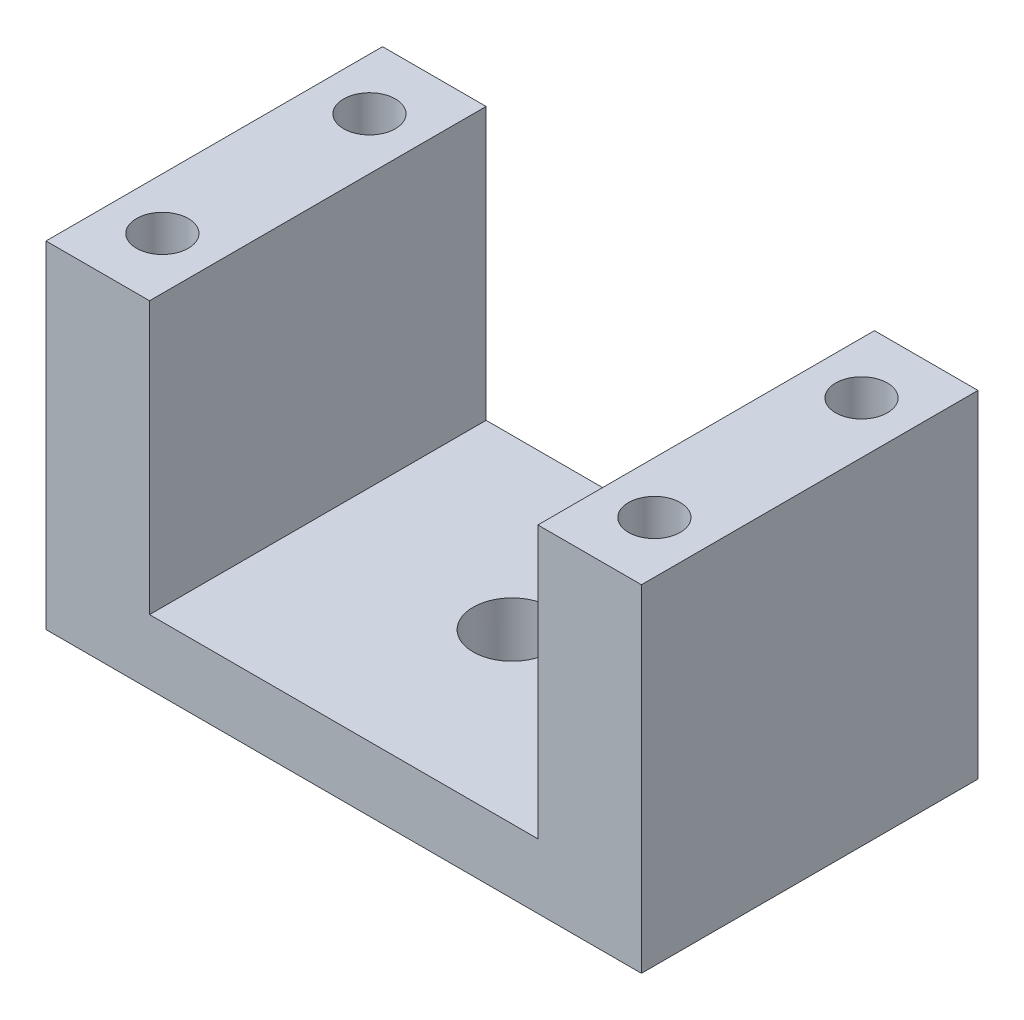
ISO-10303-21;
HEADER;
FILE_DESCRIPTION(('STEP AP214'),'2;1');
FILE_NAME('part.step','',(''),(''),'','','');
FILE_SCHEMA(('AUTOMOTIVE_DESIGN { 1 0 10303 214 1 1 1 1 }'));
ENDSEC;
DATA;
#1=APPLICATION_CONTEXT('core data for automotive mechanical design processes');
#2=APPLICATION_PROTOCOL_DEFINITION('international standard','automotive_design',2000,#1);
#3=PRODUCT_CONTEXT('',#1,'mechanical');
#4=PRODUCT('Part','Part','',(#3));
#5=PRODUCT_RELATED_PRODUCT_CATEGORY('part','',(#4));
#6=PRODUCT_DEFINITION_FORMATION('','',#4);
#7=PRODUCT_DEFINITION_CONTEXT('part definition',#1,'design');
#8=PRODUCT_DEFINITION('design','',#6,#7);
#9=PRODUCT_DEFINITION_SHAPE('','',#8);
#10=(LENGTH_UNIT() NAMED_UNIT(*) SI_UNIT(.MILLI.,.METRE.));
#11=(NAMED_UNIT(*) PLANE_ANGLE_UNIT() SI_UNIT($,.RADIAN.));
#12=(NAMED_UNIT(*) SI_UNIT($,.STERADIAN.) SOLID_ANGLE_UNIT());
#13=UNCERTAINTY_MEASURE_WITH_UNIT(LENGTH_MEASURE(1.E-05),#10,'distance_accuracy_value','');
#14=(GEOMETRIC_REPRESENTATION_CONTEXT(3) GLOBAL_UNCERTAINTY_ASSIGNED_CONTEXT((#13)) GLOBAL_UNIT_ASSIGNED_CONTEXT((#10,
#11,#12)) REPRESENTATION_CONTEXT('',''));
#15=CARTESIAN_POINT('',(0.,0.,0.));
#16=DIRECTION('',(0.,0.,1.));
#17=DIRECTION('',(1.,0.,0.));
#18=AXIS2_PLACEMENT_3D('',#15,#16,#17);
#19=CARTESIAN_POINT('',(11.5,6.5,13.));
#20=DIRECTION('',(-1.,0.,0.));
#21=DIRECTION('',(0.,0.,1.));
#22=AXIS2_PLACEMENT_3D('',#19,#20,#21);
#23=PLANE('',#22);
#24=DIRECTION('',(0.,1.,0.));
#25=VECTOR('',#24,1.);
#26=CARTESIAN_POINT('',(11.5,6.5,0.));
#27=LINE('',#26,#25);
#28=CARTESIAN_POINT('',(11.5,-6.5,0.));
#29=VERTEX_POINT('',#28);
#30=CARTESIAN_POINT('',(11.5,6.5,0.));
#31=VERTEX_POINT('',#30);
#32=EDGE_CURVE('E130',#29,#31,#27,.T.);
#33=ORIENTED_EDGE('',*,*,#32,.T.);
#34=DIRECTION('',(0.,0.,-1.));
#35=VECTOR('',#34,1.);
#36=CARTESIAN_POINT('',(11.5,6.5,13.));
#37=LINE('',#36,#35);
#38=CARTESIAN_POINT('',(11.5,6.5,13.));
#39=VERTEX_POINT('',#38);
#40=EDGE_CURVE('E11',#39,#31,#37,.T.);
#41=ORIENTED_EDGE('',*,*,#40,.F.);
#42=DIRECTION('',(0.,1.,0.));
#43=VECTOR('',#42,1.);
#44=CARTESIAN_POINT('',(11.5,6.5,13.));
#45=LINE('',#44,#43);
#46=CARTESIAN_POINT('',(11.5,-6.5,13.));
#47=VERTEX_POINT('',#46);
#48=EDGE_CURVE('E145',#47,#39,#45,.T.);
#49=ORIENTED_EDGE('',*,*,#48,.F.);
#50=DIRECTION('',(0.,0.,-1.));
#51=VECTOR('',#50,1.);
#52=CARTESIAN_POINT('',(11.5,-6.5,13.));
#53=LINE('',#52,#51);
#54=EDGE_CURVE('E126',#47,#29,#53,.T.);
#55=ORIENTED_EDGE('',*,*,#54,.T.);
#56=EDGE_LOOP('',(#33,#41,#49,#55));
#57=FACE_BOUND('',#56,.T.);
#58=ADVANCED_FACE('F34',(#57),#23,.F.);
#59=CARTESIAN_POINT('',(7.5,6.5,13.));
#60=DIRECTION('',(0.,-1.,0.));
#61=DIRECTION('',(0.,0.,-1.));
#62=AXIS2_PLACEMENT_3D('',#59,#60,#61);
#63=PLANE('',#62);
#64=CARTESIAN_POINT('',(9.5,6.5,2.5));
#65=DIRECTION('',(0.,1.,0.));
#66=DIRECTION('',(0.,0.,1.));
#67=AXIS2_PLACEMENT_3D('',#64,#65,#66);
#68=CIRCLE('',#67,1.);
#69=CARTESIAN_POINT('',(9.5,6.5,3.5));
#70=VERTEX_POINT('',#69);
#71=EDGE_CURVE('E187',#70,#70,#68,.T.);
#72=ORIENTED_EDGE('',*,*,#71,.F.);
#73=EDGE_LOOP('',(#72));
#74=FACE_BOUND('',#73,.T.);
#75=CARTESIAN_POINT('',(9.5,6.5,10.5));
#76=DIRECTION('',(0.,1.,0.));
#77=DIRECTION('',(0.,0.,1.));
#78=AXIS2_PLACEMENT_3D('',#75,#76,#77);
#79=CIRCLE('',#78,1.);
#80=CARTESIAN_POINT('',(9.5,6.5,11.5));
#81=VERTEX_POINT('',#80);
#82=EDGE_CURVE('E202',#81,#81,#79,.T.);
#83=ORIENTED_EDGE('',*,*,#82,.F.);
#84=EDGE_LOOP('',(#83));
#85=FACE_BOUND('',#84,.T.);
#86=DIRECTION('',(-1.,0.,0.));
#87=VECTOR('',#86,1.);
#88=CARTESIAN_POINT('',(7.5,6.5,0.));
#89=LINE('',#88,#87);
#90=CARTESIAN_POINT('',(7.5,6.5,0.));
#91=VERTEX_POINT('',#90);
#92=EDGE_CURVE('E133',#31,#91,#89,.T.);
#93=ORIENTED_EDGE('',*,*,#92,.T.);
#94=DIRECTION('',(0.,0.,-1.));
#95=VECTOR('',#94,1.);
#96=CARTESIAN_POINT('',(7.5,6.5,13.));
#97=LINE('',#96,#95);
#98=CARTESIAN_POINT('',(7.5,6.5,13.));
#99=VERTEX_POINT('',#98);
#100=EDGE_CURVE('E42',#99,#91,#97,.T.);
#101=ORIENTED_EDGE('',*,*,#100,.F.);
#102=DIRECTION('',(-1.,0.,0.));
#103=VECTOR('',#102,1.);
#104=CARTESIAN_POINT('',(7.5,6.5,13.));
#105=LINE('',#104,#103);
#106=EDGE_CURVE('E93',#39,#99,#105,.T.);
#107=ORIENTED_EDGE('',*,*,#106,.F.);
#108=ORIENTED_EDGE('',*,*,#40,.T.);
#109=EDGE_LOOP('',(#93,#101,#107,#108));
#110=FACE_BOUND('',#109,.T.);
#111=ADVANCED_FACE('F219',(#74,#85,#110),#63,.F.);
#112=CARTESIAN_POINT('',(7.5,-4.,13.));
#113=DIRECTION('',(1.,0.,0.));
#114=DIRECTION('',(0.,1.,0.));
#115=AXIS2_PLACEMENT_3D('',#112,#113,#114);
#116=PLANE('',#115);
#117=DIRECTION('',(0.,-1.,0.));
#118=VECTOR('',#117,1.);
#119=CARTESIAN_POINT('',(7.5,-4.,0.));
#120=LINE('',#119,#118);
#121=CARTESIAN_POINT('',(7.5,-4.,0.));
#122=VERTEX_POINT('',#121);
#123=EDGE_CURVE('E136',#91,#122,#120,.T.);
#124=ORIENTED_EDGE('',*,*,#123,.T.);
#125=DIRECTION('',(0.,0.,-1.));
#126=VECTOR('',#125,1.);
#127=CARTESIAN_POINT('',(7.5,-4.,13.));
#128=LINE('',#127,#126);
#129=CARTESIAN_POINT('',(7.5,-4.,13.));
#130=VERTEX_POINT('',#129);
#131=EDGE_CURVE('E152',#130,#122,#128,.T.);
#132=ORIENTED_EDGE('',*,*,#131,.F.);
#133=DIRECTION('',(0.,-1.,0.));
#134=VECTOR('',#133,1.);
#135=CARTESIAN_POINT('',(7.5,-4.,13.));
#136=LINE('',#135,#134);
#137=EDGE_CURVE('E160',#99,#130,#136,.T.);
#138=ORIENTED_EDGE('',*,*,#137,.F.);
#139=ORIENTED_EDGE('',*,*,#100,.T.);
#140=EDGE_LOOP('',(#124,#132,#138,#139));
#141=FACE_BOUND('',#140,.T.);
#142=ADVANCED_FACE('F158',(#141),#116,.F.);
#143=CARTESIAN_POINT('',(-7.5,-4.,13.));
#144=DIRECTION('',(0.,-1.,0.));
#145=DIRECTION('',(0.,0.,-1.));
#146=AXIS2_PLACEMENT_3D('',#143,#144,#145);
#147=PLANE('',#146);
#148=CARTESIAN_POINT('',(0.,-4.,6.5));
#149=DIRECTION('',(0.,-1.,0.));
#150=DIRECTION('',(0.,0.,-1.));
#151=AXIS2_PLACEMENT_3D('',#148,#149,#150);
#152=CIRCLE('',#151,1.5);
#153=CARTESIAN_POINT('',(0.,-4.,5.));
#154=VERTEX_POINT('',#153);
#155=EDGE_CURVE('E134',#154,#154,#152,.T.);
#156=ORIENTED_EDGE('',*,*,#155,.T.);
#157=EDGE_LOOP('',(#156));
#158=FACE_BOUND('',#157,.T.);
#159=DIRECTION('',(-1.,0.,0.));
#160=VECTOR('',#159,1.);
#161=CARTESIAN_POINT('',(-7.5,-4.,0.));
#162=LINE('',#161,#160);
#163=CARTESIAN_POINT('',(-7.5,-4.,0.));
#164=VERTEX_POINT('',#163);
#165=EDGE_CURVE('E138',#122,#164,#162,.T.);
#166=ORIENTED_EDGE('',*,*,#165,.T.);
#167=DIRECTION('',(0.,0.,-1.));
#168=VECTOR('',#167,1.);
#169=CARTESIAN_POINT('',(-7.5,-4.,13.));
#170=LINE('',#169,#168);
#171=CARTESIAN_POINT('',(-7.5,-4.,13.));
#172=VERTEX_POINT('',#171);
#173=EDGE_CURVE('E149',#172,#164,#170,.T.);
#174=ORIENTED_EDGE('',*,*,#173,.F.);
#175=DIRECTION('',(-1.,0.,0.));
#176=VECTOR('',#175,1.);
#177=CARTESIAN_POINT('',(-7.5,-4.,13.));
#178=LINE('',#177,#176);
#179=EDGE_CURVE('E172',#130,#172,#178,.T.);
#180=ORIENTED_EDGE('',*,*,#179,.F.);
#181=ORIENTED_EDGE('',*,*,#131,.T.);
#182=EDGE_LOOP('',(#166,#174,#180,#181));
#183=FACE_BOUND('',#182,.T.);
#184=ADVANCED_FACE('F168',(#158,#183),#147,.F.);
#185=CARTESIAN_POINT('',(-7.5,6.5,13.));
#186=DIRECTION('',(-1.,0.,0.));
#187=DIRECTION('',(0.,-1.,0.));
#188=AXIS2_PLACEMENT_3D('',#185,#186,#187);
#189=PLANE('',#188);
#190=DIRECTION('',(0.,1.,0.));
#191=VECTOR('',#190,1.);
#192=CARTESIAN_POINT('',(-7.5,6.5,0.));
#193=LINE('',#192,#191);
#194=CARTESIAN_POINT('',(-7.5,6.5,0.));
#195=VERTEX_POINT('',#194);
#196=EDGE_CURVE('E140',#164,#195,#193,.T.);
#197=ORIENTED_EDGE('',*,*,#196,.T.);
#198=DIRECTION('',(0.,0.,-1.));
#199=VECTOR('',#198,1.);
#200=CARTESIAN_POINT('',(-7.5,6.5,13.));
#201=LINE('',#200,#199);
#202=CARTESIAN_POINT('',(-7.5,6.5,13.));
#203=VERTEX_POINT('',#202);
#204=EDGE_CURVE('E121',#203,#195,#201,.T.);
#205=ORIENTED_EDGE('',*,*,#204,.F.);
#206=DIRECTION('',(0.,1.,0.));
#207=VECTOR('',#206,1.);
#208=CARTESIAN_POINT('',(-7.5,6.5,13.));
#209=LINE('',#208,#207);
#210=EDGE_CURVE('E112',#172,#203,#209,.T.);
#211=ORIENTED_EDGE('',*,*,#210,.F.);
#212=ORIENTED_EDGE('',*,*,#173,.T.);
#213=EDGE_LOOP('',(#197,#205,#211,#212));
#214=FACE_BOUND('',#213,.T.);
#215=ADVANCED_FACE('F171',(#214),#189,.F.);
#216=CARTESIAN_POINT('',(-11.5,6.5,13.));
#217=DIRECTION('',(0.,-1.,0.));
#218=DIRECTION('',(0.,0.,-1.));
#219=AXIS2_PLACEMENT_3D('',#216,#217,#218);
#220=PLANE('',#219);
#221=CARTESIAN_POINT('',(-9.50489538220928,6.5,10.5));
#222=DIRECTION('',(0.,1.,0.));
#223=DIRECTION('',(0.,0.,1.));
#224=AXIS2_PLACEMENT_3D('',#221,#222,#223);
#225=CIRCLE('',#224,1.);
#226=CARTESIAN_POINT('',(-9.50489538220928,6.5,11.5));
#227=VERTEX_POINT('',#226);
#228=EDGE_CURVE('E194',#227,#227,#225,.T.);
#229=ORIENTED_EDGE('',*,*,#228,.F.);
#230=EDGE_LOOP('',(#229));
#231=FACE_BOUND('',#230,.T.);
#232=CARTESIAN_POINT('',(-9.50489538220928,6.5,2.5));
#233=DIRECTION('',(0.,1.,0.));
#234=DIRECTION('',(0.,0.,1.));
#235=AXIS2_PLACEMENT_3D('',#232,#233,#234);
#236=CIRCLE('',#235,1.);
#237=CARTESIAN_POINT('',(-9.50489538220928,6.5,3.5));
#238=VERTEX_POINT('',#237);
#239=EDGE_CURVE('E181',#238,#238,#236,.T.);
#240=ORIENTED_EDGE('',*,*,#239,.F.);
#241=EDGE_LOOP('',(#240));
#242=FACE_BOUND('',#241,.T.);
#243=DIRECTION('',(-1.,0.,0.));
#244=VECTOR('',#243,1.);
#245=CARTESIAN_POINT('',(-11.5,6.5,0.));
#246=LINE('',#245,#244);
#247=CARTESIAN_POINT('',(-11.5,6.5,0.));
#248=VERTEX_POINT('',#247);
#249=EDGE_CURVE('E120',#195,#248,#246,.T.);
#250=ORIENTED_EDGE('',*,*,#249,.T.);
#251=DIRECTION('',(0.,0.,-1.));
#252=VECTOR('',#251,1.);
#253=CARTESIAN_POINT('',(-11.5,6.5,13.));
#254=LINE('',#253,#252);
#255=CARTESIAN_POINT('',(-11.5,6.5,13.));
#256=VERTEX_POINT('',#255);
#257=EDGE_CURVE('E117',#256,#248,#254,.T.);
#258=ORIENTED_EDGE('',*,*,#257,.F.);
#259=DIRECTION('',(-1.,0.,0.));
#260=VECTOR('',#259,1.);
#261=CARTESIAN_POINT('',(-11.5,6.5,13.));
#262=LINE('',#261,#260);
#263=EDGE_CURVE('E106',#203,#256,#262,.T.);
#264=ORIENTED_EDGE('',*,*,#263,.F.);
#265=ORIENTED_EDGE('',*,*,#204,.T.);
#266=EDGE_LOOP('',(#250,#258,#264,#265));
#267=FACE_BOUND('',#266,.T.);
#268=ADVANCED_FACE('F118',(#231,#242,#267),#220,.F.);
#269=CARTESIAN_POINT('',(-11.5,6.5,13.));
#270=DIRECTION('',(1.,0.,0.));
#271=DIRECTION('',(0.,0.,-1.));
#272=AXIS2_PLACEMENT_3D('',#269,#270,#271);
#273=PLANE('',#272);
#274=DIRECTION('',(0.,-1.,0.));
#275=VECTOR('',#274,1.);
#276=CARTESIAN_POINT('',(-11.5,6.5,0.));
#277=LINE('',#276,#275);
#278=CARTESIAN_POINT('',(-11.5,-6.5,0.));
#279=VERTEX_POINT('',#278);
#280=EDGE_CURVE('E79',#248,#279,#277,.T.);
#281=ORIENTED_EDGE('',*,*,#280,.T.);
#282=DIRECTION('',(0.,0.,-1.));
#283=VECTOR('',#282,1.);
#284=CARTESIAN_POINT('',(-11.5,-6.5,13.));
#285=LINE('',#284,#283);
#286=CARTESIAN_POINT('',(-11.5,-6.5,13.));
#287=VERTEX_POINT('',#286);
#288=EDGE_CURVE('E122',#287,#279,#285,.T.);
#289=ORIENTED_EDGE('',*,*,#288,.F.);
#290=DIRECTION('',(0.,-1.,0.));
#291=VECTOR('',#290,1.);
#292=CARTESIAN_POINT('',(-11.5,6.5,13.));
#293=LINE('',#292,#291);
#294=EDGE_CURVE('E110',#256,#287,#293,.T.);
#295=ORIENTED_EDGE('',*,*,#294,.F.);
#296=ORIENTED_EDGE('',*,*,#257,.T.);
#297=EDGE_LOOP('',(#281,#289,#295,#296));
#298=FACE_BOUND('',#297,.T.);
#299=ADVANCED_FACE('F124',(#298),#273,.F.);
#300=CARTESIAN_POINT('',(-11.5,-6.5,13.));
#301=DIRECTION('',(0.,1.,0.));
#302=DIRECTION('',(-1.,0.,0.));
#303=AXIS2_PLACEMENT_3D('',#300,#301,#302);
#304=PLANE('',#303);
#305=CARTESIAN_POINT('',(-9.50489538220928,-6.5,10.5));
#306=DIRECTION('',(0.,1.,0.));
#307=DIRECTION('',(0.,0.,1.));
#308=AXIS2_PLACEMENT_3D('',#305,#306,#307);
#309=CIRCLE('',#308,1.);
#310=CARTESIAN_POINT('',(-9.50489538220928,-6.5,11.5));
#311=VERTEX_POINT('',#310);
#312=EDGE_CURVE('E184',#311,#311,#309,.T.);
#313=ORIENTED_EDGE('',*,*,#312,.T.);
#314=EDGE_LOOP('',(#313));
#315=FACE_BOUND('',#314,.T.);
#316=CARTESIAN_POINT('',(9.5,-6.5,2.5));
#317=DIRECTION('',(0.,1.,0.));
#318=DIRECTION('',(0.,0.,1.));
#319=AXIS2_PLACEMENT_3D('',#316,#317,#318);
#320=CIRCLE('',#319,1.);
#321=CARTESIAN_POINT('',(9.5,-6.5,3.5));
#322=VERTEX_POINT('',#321);
#323=EDGE_CURVE('E190',#322,#322,#320,.T.);
#324=ORIENTED_EDGE('',*,*,#323,.T.);
#325=EDGE_LOOP('',(#324));
#326=FACE_BOUND('',#325,.T.);
#327=CARTESIAN_POINT('',(9.5,-6.5,10.5));
#328=DIRECTION('',(0.,1.,0.));
#329=DIRECTION('',(0.,0.,1.));
#330=AXIS2_PLACEMENT_3D('',#327,#328,#329);
#331=CIRCLE('',#330,1.);
#332=CARTESIAN_POINT('',(9.5,-6.5,11.5));
#333=VERTEX_POINT('',#332);
#334=EDGE_CURVE('E191',#333,#333,#331,.T.);
#335=ORIENTED_EDGE('',*,*,#334,.T.);
#336=EDGE_LOOP('',(#335));
#337=FACE_BOUND('',#336,.T.);
#338=CARTESIAN_POINT('',(0.,-6.5,6.5));
#339=DIRECTION('',(0.,1.,0.));
#340=DIRECTION('',(0.,0.,1.));
#341=AXIS2_PLACEMENT_3D('',#338,#339,#340);
#342=CIRCLE('',#341,1.5);
#343=CARTESIAN_POINT('',(0.,-6.5,8.));
#344=VERTEX_POINT('',#343);
#345=EDGE_CURVE('E199',#344,#344,#342,.T.);
#346=ORIENTED_EDGE('',*,*,#345,.T.);
#347=EDGE_LOOP('',(#346));
#348=FACE_BOUND('',#347,.T.);
#349=CARTESIAN_POINT('',(-9.50489538220928,-6.5,2.5));
#350=DIRECTION('',(0.,1.,0.));
#351=DIRECTION('',(0.,0.,1.));
#352=AXIS2_PLACEMENT_3D('',#349,#350,#351);
#353=CIRCLE('',#352,1.);
#354=CARTESIAN_POINT('',(-9.50489538220928,-6.5,3.5));
#355=VERTEX_POINT('',#354);
#356=EDGE_CURVE('E180',#355,#355,#353,.T.);
#357=ORIENTED_EDGE('',*,*,#356,.T.);
#358=EDGE_LOOP('',(#357));
#359=FACE_BOUND('',#358,.T.);
#360=DIRECTION('',(1.,0.,0.));
#361=VECTOR('',#360,1.);
#362=CARTESIAN_POINT('',(-11.5,-6.5,0.));
#363=LINE('',#362,#361);
#364=EDGE_CURVE('E85',#279,#29,#363,.T.);
#365=ORIENTED_EDGE('',*,*,#364,.T.);
#366=ORIENTED_EDGE('',*,*,#54,.F.);
#367=DIRECTION('',(1.,0.,0.));
#368=VECTOR('',#367,1.);
#369=CARTESIAN_POINT('',(-11.5,-6.5,13.));
#370=LINE('',#369,#368);
#371=EDGE_CURVE('E50',#287,#47,#370,.T.);
#372=ORIENTED_EDGE('',*,*,#371,.F.);
#373=ORIENTED_EDGE('',*,*,#288,.T.);
#374=EDGE_LOOP('',(#365,#366,#372,#373));
#375=FACE_BOUND('',#374,.T.);
#376=ADVANCED_FACE('F208',(#315,#326,#337,#348,#359,#375),#304,.F.);
#377=CARTESIAN_POINT('',(0.,0.,13.));
#378=DIRECTION('',(0.,0.,1.));
#379=DIRECTION('',(1.,0.,0.));
#380=AXIS2_PLACEMENT_3D('',#377,#378,#379);
#381=PLANE('',#380);
#382=ORIENTED_EDGE('',*,*,#48,.T.);
#383=ORIENTED_EDGE('',*,*,#106,.T.);
#384=ORIENTED_EDGE('',*,*,#137,.T.);
#385=ORIENTED_EDGE('',*,*,#179,.T.);
#386=ORIENTED_EDGE('',*,*,#210,.T.);
#387=ORIENTED_EDGE('',*,*,#263,.T.);
#388=ORIENTED_EDGE('',*,*,#294,.T.);
#389=ORIENTED_EDGE('',*,*,#371,.T.);
#390=EDGE_LOOP('',(#382,#383,#384,#385,#386,#387,#388,#389));
#391=FACE_BOUND('',#390,.T.);
#392=ADVANCED_FACE('F108',(#391),#381,.T.);
#393=CARTESIAN_POINT('',(0.,0.,0.));
#394=DIRECTION('',(0.,0.,1.));
#395=DIRECTION('',(1.,0.,0.));
#396=AXIS2_PLACEMENT_3D('',#393,#394,#395);
#397=PLANE('',#396);
#398=ORIENTED_EDGE('',*,*,#32,.F.);
#399=ORIENTED_EDGE('',*,*,#364,.F.);
#400=ORIENTED_EDGE('',*,*,#280,.F.);
#401=ORIENTED_EDGE('',*,*,#249,.F.);
#402=ORIENTED_EDGE('',*,*,#196,.F.);
#403=ORIENTED_EDGE('',*,*,#165,.F.);
#404=ORIENTED_EDGE('',*,*,#123,.F.);
#405=ORIENTED_EDGE('',*,*,#92,.F.);
#406=EDGE_LOOP('',(#398,#399,#400,#401,#402,#403,#404,#405));
#407=FACE_BOUND('',#406,.T.);
#408=ADVANCED_FACE('F164',(#407),#397,.F.);
#409=CARTESIAN_POINT('',(-9.50489538220928,-6.5,2.5));
#410=DIRECTION('',(0.,1.,0.));
#411=DIRECTION('',(0.,0.,1.));
#412=AXIS2_PLACEMENT_3D('',#409,#410,#411);
#413=CYLINDRICAL_SURFACE('',#412,1.);
#414=ORIENTED_EDGE('',*,*,#356,.F.);
#415=EDGE_LOOP('',(#414));
#416=FACE_BOUND('',#415,.T.);
#417=ORIENTED_EDGE('',*,*,#239,.T.);
#418=EDGE_LOOP('',(#417));
#419=FACE_BOUND('',#418,.T.);
#420=ADVANCED_FACE('F288',(#416,#419),#413,.F.);
#421=CARTESIAN_POINT('',(0.,-6.5,6.5));
#422=DIRECTION('',(0.,1.,0.));
#423=DIRECTION('',(0.,0.,1.));
#424=AXIS2_PLACEMENT_3D('',#421,#422,#423);
#425=CYLINDRICAL_SURFACE('',#424,1.5);
#426=ORIENTED_EDGE('',*,*,#345,.F.);
#427=EDGE_LOOP('',(#426));
#428=FACE_BOUND('',#427,.T.);
#429=ORIENTED_EDGE('',*,*,#155,.F.);
#430=EDGE_LOOP('',(#429));
#431=FACE_BOUND('',#430,.T.);
#432=ADVANCED_FACE('F215',(#428,#431),#425,.F.);
#433=CARTESIAN_POINT('',(9.5,-6.5,10.5));
#434=DIRECTION('',(0.,1.,0.));
#435=DIRECTION('',(0.,0.,1.));
#436=AXIS2_PLACEMENT_3D('',#433,#434,#435);
#437=CYLINDRICAL_SURFACE('',#436,1.);
#438=ORIENTED_EDGE('',*,*,#334,.F.);
#439=EDGE_LOOP('',(#438));
#440=FACE_BOUND('',#439,.T.);
#441=ORIENTED_EDGE('',*,*,#82,.T.);
#442=EDGE_LOOP('',(#441));
#443=FACE_BOUND('',#442,.T.);
#444=ADVANCED_FACE('F211',(#440,#443),#437,.F.);
#445=CARTESIAN_POINT('',(9.5,-6.5,2.5));
#446=DIRECTION('',(0.,1.,0.));
#447=DIRECTION('',(0.,0.,1.));
#448=AXIS2_PLACEMENT_3D('',#445,#446,#447);
#449=CYLINDRICAL_SURFACE('',#448,1.);
#450=ORIENTED_EDGE('',*,*,#323,.F.);
#451=EDGE_LOOP('',(#450));
#452=FACE_BOUND('',#451,.T.);
#453=ORIENTED_EDGE('',*,*,#71,.T.);
#454=EDGE_LOOP('',(#453));
#455=FACE_BOUND('',#454,.T.);
#456=ADVANCED_FACE('F214',(#452,#455),#449,.F.);
#457=CARTESIAN_POINT('',(-9.50489538220928,-6.5,10.5));
#458=DIRECTION('',(0.,1.,0.));
#459=DIRECTION('',(0.,0.,1.));
#460=AXIS2_PLACEMENT_3D('',#457,#458,#459);
#461=CYLINDRICAL_SURFACE('',#460,1.);
#462=ORIENTED_EDGE('',*,*,#312,.F.);
#463=EDGE_LOOP('',(#462));
#464=FACE_BOUND('',#463,.T.);
#465=ORIENTED_EDGE('',*,*,#228,.T.);
#466=EDGE_LOOP('',(#465));
#467=FACE_BOUND('',#466,.T.);
#468=ADVANCED_FACE('F314',(#464,#467),#461,.F.);
#469=CLOSED_SHELL('',(#58,#111,#142,#184,#215,#268,#299,#376,#392,#408,#420,#432,#444,#456,#468));
#470=MANIFOLD_SOLID_BREP('B2',#469);
#471=ADVANCED_BREP_SHAPE_REPRESENTATION('',(#18,#470),#14);
#472=SHAPE_DEFINITION_REPRESENTATION(#9,#471);
ENDSEC;
END-ISO-10303-21;
